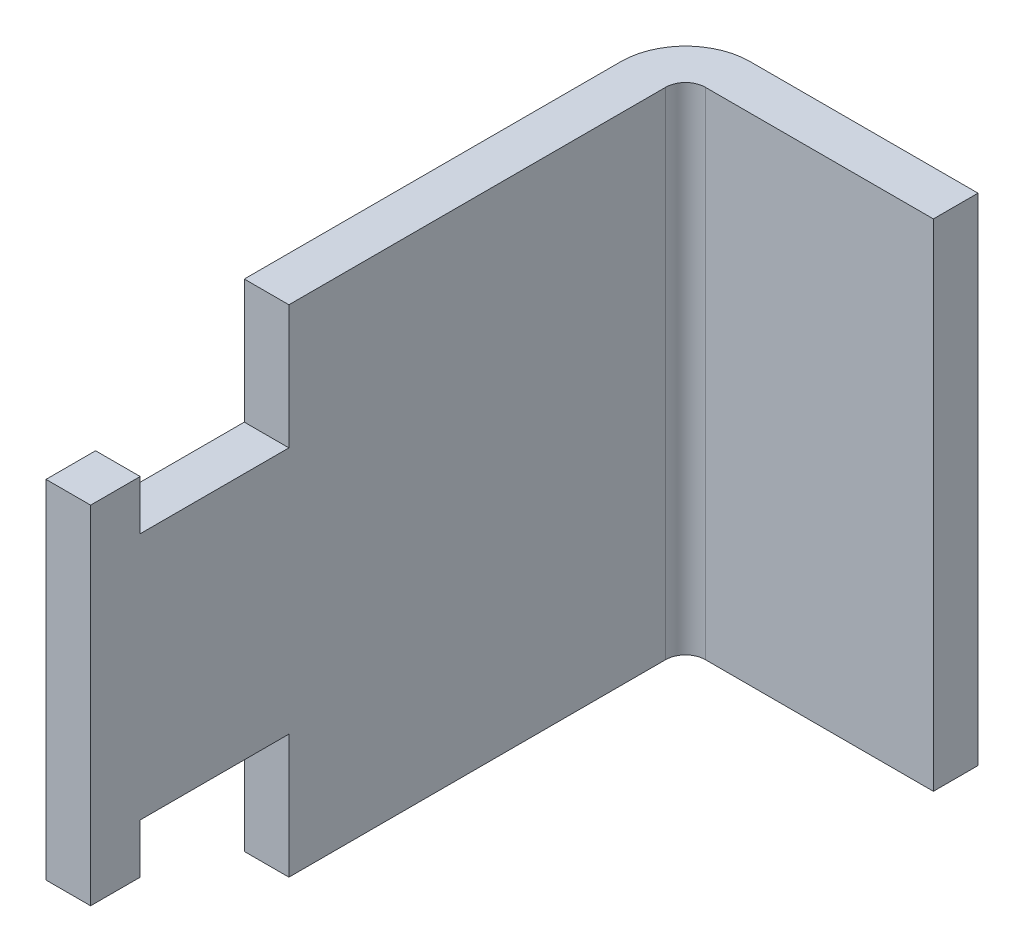
ISO-10303-21;
HEADER;
FILE_DESCRIPTION(('STEP AP214'),'2;1');
FILE_NAME('part.step','',(''),(''),'','','');
FILE_SCHEMA(('AUTOMOTIVE_DESIGN { 1 0 10303 214 1 1 1 1 }'));
ENDSEC;
DATA;
#1=APPLICATION_CONTEXT('core data for automotive mechanical design processes');
#2=APPLICATION_PROTOCOL_DEFINITION('international standard','automotive_design',2000,#1);
#3=PRODUCT_CONTEXT('',#1,'mechanical');
#4=PRODUCT('Part','Part','',(#3));
#5=PRODUCT_RELATED_PRODUCT_CATEGORY('part','',(#4));
#6=PRODUCT_DEFINITION_FORMATION('','',#4);
#7=PRODUCT_DEFINITION_CONTEXT('part definition',#1,'design');
#8=PRODUCT_DEFINITION('design','',#6,#7);
#9=PRODUCT_DEFINITION_SHAPE('','',#8);
#10=(LENGTH_UNIT() NAMED_UNIT(*) SI_UNIT(.MILLI.,.METRE.));
#11=(NAMED_UNIT(*) PLANE_ANGLE_UNIT() SI_UNIT($,.RADIAN.));
#12=(NAMED_UNIT(*) SI_UNIT($,.STERADIAN.) SOLID_ANGLE_UNIT());
#13=UNCERTAINTY_MEASURE_WITH_UNIT(LENGTH_MEASURE(1.E-05),#10,'distance_accuracy_value','');
#14=(GEOMETRIC_REPRESENTATION_CONTEXT(3) GLOBAL_UNCERTAINTY_ASSIGNED_CONTEXT((#13)) GLOBAL_UNIT_ASSIGNED_CONTEXT((#10,
#11,#12)) REPRESENTATION_CONTEXT('',''));
#15=CARTESIAN_POINT('',(0.,0.,0.));
#16=DIRECTION('',(0.,0.,1.));
#17=DIRECTION('',(1.,0.,0.));
#18=AXIS2_PLACEMENT_3D('',#15,#16,#17);
#19=CARTESIAN_POINT('',(2.95,-2.5,0.));
#20=DIRECTION('',(1.,0.,0.));
#21=DIRECTION('',(0.,1.,0.));
#22=AXIS2_PLACEMENT_3D('',#19,#20,#21);
#23=PLANE('',#22);
#24=DIRECTION('',(0.,0.,1.));
#25=VECTOR('',#24,1.);
#26=CARTESIAN_POINT('',(2.95,2.5,0.));
#27=LINE('',#26,#25);
#28=CARTESIAN_POINT('',(2.95,2.5,0.));
#29=VERTEX_POINT('',#28);
#30=CARTESIAN_POINT('',(2.95,2.5,0.45));
#31=VERTEX_POINT('',#30);
#32=EDGE_CURVE('E139',#29,#31,#27,.T.);
#33=ORIENTED_EDGE('',*,*,#32,.T.);
#34=DIRECTION('',(0.,1.,0.));
#35=VECTOR('',#34,1.);
#36=CARTESIAN_POINT('',(2.95,2.5,0.45));
#37=LINE('',#36,#35);
#38=CARTESIAN_POINT('',(2.95,-2.5,0.45));
#39=VERTEX_POINT('',#38);
#40=EDGE_CURVE('E280',#31,#39,#37,.F.);
#41=ORIENTED_EDGE('',*,*,#40,.T.);
#42=DIRECTION('',(0.,0.,1.));
#43=VECTOR('',#42,1.);
#44=CARTESIAN_POINT('',(2.95,-2.5,0.));
#45=LINE('',#44,#43);
#46=CARTESIAN_POINT('',(2.95,-2.5,0.));
#47=VERTEX_POINT('',#46);
#48=EDGE_CURVE('E325',#39,#47,#45,.F.);
#49=ORIENTED_EDGE('',*,*,#48,.T.);
#50=DIRECTION('',(0.,1.,0.));
#51=VECTOR('',#50,1.);
#52=CARTESIAN_POINT('',(2.95,-2.5,0.));
#53=LINE('',#52,#51);
#54=EDGE_CURVE('E277',#47,#29,#53,.T.);
#55=ORIENTED_EDGE('',*,*,#54,.T.);
#56=EDGE_LOOP('',(#33,#41,#49,#55));
#57=FACE_BOUND('',#56,.T.);
#58=ADVANCED_FACE('F17',(#57),#23,.T.);
#59=CARTESIAN_POINT('',(0.65,-2.5,0.65));
#60=DIRECTION('',(0.,-1.,0.));
#61=DIRECTION('',(1.,0.,0.));
#62=AXIS2_PLACEMENT_3D('',#59,#60,#61);
#63=CYLINDRICAL_SURFACE('',#62,0.65);
#64=CARTESIAN_POINT('',(0.65,2.5,0.65));
#65=DIRECTION('',(0.,-1.,0.));
#66=DIRECTION('',(1.,0.,0.));
#67=AXIS2_PLACEMENT_3D('',#64,#65,#66);
#68=CIRCLE('',#67,0.65);
#69=CARTESIAN_POINT('',(0.,2.5,0.65));
#70=VERTEX_POINT('',#69);
#71=CARTESIAN_POINT('',(0.65,2.5,0.));
#72=VERTEX_POINT('',#71);
#73=EDGE_CURVE('E138',#70,#72,#68,.T.);
#74=ORIENTED_EDGE('',*,*,#73,.T.);
#75=DIRECTION('',(0.,1.,0.));
#76=VECTOR('',#75,1.);
#77=CARTESIAN_POINT('',(0.65,-2.5,0.));
#78=LINE('',#77,#76);
#79=CARTESIAN_POINT('',(0.65,-2.5,0.));
#80=VERTEX_POINT('',#79);
#81=EDGE_CURVE('E136',#72,#80,#78,.F.);
#82=ORIENTED_EDGE('',*,*,#81,.T.);
#83=CARTESIAN_POINT('',(0.65,-2.5,0.65));
#84=DIRECTION('',(0.,-1.,0.));
#85=DIRECTION('',(1.,0.,0.));
#86=AXIS2_PLACEMENT_3D('',#83,#84,#85);
#87=CIRCLE('',#86,0.65);
#88=CARTESIAN_POINT('',(0.,-2.5,0.65));
#89=VERTEX_POINT('',#88);
#90=EDGE_CURVE('E20',#80,#89,#87,.F.);
#91=ORIENTED_EDGE('',*,*,#90,.T.);
#92=DIRECTION('',(0.,1.,0.));
#93=VECTOR('',#92,1.);
#94=CARTESIAN_POINT('',(0.,-2.5,0.65));
#95=LINE('',#94,#93);
#96=EDGE_CURVE('E133',#89,#70,#95,.T.);
#97=ORIENTED_EDGE('',*,*,#96,.T.);
#98=EDGE_LOOP('',(#74,#82,#91,#97));
#99=FACE_BOUND('',#98,.T.);
#100=ADVANCED_FACE('F132',(#99),#63,.T.);
#101=CARTESIAN_POINT('',(2.95,2.5,0.45));
#102=DIRECTION('',(0.,0.,-1.));
#103=DIRECTION('',(-1.,0.,0.));
#104=AXIS2_PLACEMENT_3D('',#101,#102,#103);
#105=PLANE('',#104);
#106=DIRECTION('',(0.,1.,0.));
#107=VECTOR('',#106,1.);
#108=CARTESIAN_POINT('',(0.65,-2.5,0.45));
#109=LINE('',#108,#107);
#110=CARTESIAN_POINT('',(0.65,2.5,0.45));
#111=VERTEX_POINT('',#110);
#112=CARTESIAN_POINT('',(0.65,-2.5,0.45));
#113=VERTEX_POINT('',#112);
#114=EDGE_CURVE('E287',#111,#113,#109,.F.);
#115=ORIENTED_EDGE('',*,*,#114,.T.);
#116=DIRECTION('',(1.,0.,0.));
#117=VECTOR('',#116,1.);
#118=CARTESIAN_POINT('',(2.95,-2.5,0.45));
#119=LINE('',#118,#117);
#120=EDGE_CURVE('E158',#113,#39,#119,.T.);
#121=ORIENTED_EDGE('',*,*,#120,.T.);
#122=ORIENTED_EDGE('',*,*,#40,.F.);
#123=DIRECTION('',(1.,0.,0.));
#124=VECTOR('',#123,1.);
#125=CARTESIAN_POINT('',(2.95,2.5,0.45));
#126=LINE('',#125,#124);
#127=EDGE_CURVE('E198',#31,#111,#126,.F.);
#128=ORIENTED_EDGE('',*,*,#127,.T.);
#129=EDGE_LOOP('',(#115,#121,#122,#128));
#130=FACE_BOUND('',#129,.T.);
#131=ADVANCED_FACE('F346',(#130),#105,.F.);
#132=CARTESIAN_POINT('',(2.95,-2.5,0.));
#133=DIRECTION('',(0.,0.,1.));
#134=DIRECTION('',(1.,0.,0.));
#135=AXIS2_PLACEMENT_3D('',#132,#133,#134);
#136=PLANE('',#135);
#137=ORIENTED_EDGE('',*,*,#81,.F.);
#138=DIRECTION('',(1.,0.,0.));
#139=VECTOR('',#138,1.);
#140=CARTESIAN_POINT('',(2.95,2.5,0.));
#141=LINE('',#140,#139);
#142=EDGE_CURVE('E200',#72,#29,#141,.T.);
#143=ORIENTED_EDGE('',*,*,#142,.T.);
#144=ORIENTED_EDGE('',*,*,#54,.F.);
#145=DIRECTION('',(1.,0.,0.));
#146=VECTOR('',#145,1.);
#147=CARTESIAN_POINT('',(2.95,-2.5,0.));
#148=LINE('',#147,#146);
#149=EDGE_CURVE('E154',#47,#80,#148,.F.);
#150=ORIENTED_EDGE('',*,*,#149,.T.);
#151=EDGE_LOOP('',(#137,#143,#144,#150));
#152=FACE_BOUND('',#151,.T.);
#153=ADVANCED_FACE('F338',(#152),#136,.F.);
#154=CARTESIAN_POINT('',(0.,-2.5,0.));
#155=DIRECTION('',(1.,0.,0.));
#156=DIRECTION('',(0.,1.,0.));
#157=AXIS2_PLACEMENT_3D('',#154,#155,#156);
#158=PLANE('',#157);
#159=DIRECTION('',(0.,1.,0.));
#160=VECTOR('',#159,1.);
#161=CARTESIAN_POINT('',(0.,-2.5,6.45));
#162=LINE('',#161,#160);
#163=CARTESIAN_POINT('',(0.,1.75,6.45));
#164=VERTEX_POINT('',#163);
#165=CARTESIAN_POINT('',(0.,-1.75,6.45));
#166=VERTEX_POINT('',#165);
#167=EDGE_CURVE('E266',#164,#166,#162,.F.);
#168=ORIENTED_EDGE('',*,*,#167,.F.);
#169=DIRECTION('',(0.,0.,-1.));
#170=VECTOR('',#169,1.);
#171=CARTESIAN_POINT('',(0.,1.75,6.45));
#172=LINE('',#171,#170);
#173=CARTESIAN_POINT('',(0.,1.75,5.95));
#174=VERTEX_POINT('',#173);
#175=EDGE_CURVE('E252',#164,#174,#172,.T.);
#176=ORIENTED_EDGE('',*,*,#175,.T.);
#177=DIRECTION('',(0.,1.,0.));
#178=VECTOR('',#177,1.);
#179=CARTESIAN_POINT('',(0.,1.75,5.95));
#180=LINE('',#179,#178);
#181=CARTESIAN_POINT('',(0.,1.25,5.95));
#182=VERTEX_POINT('',#181);
#183=EDGE_CURVE('E241',#174,#182,#180,.F.);
#184=ORIENTED_EDGE('',*,*,#183,.T.);
#185=DIRECTION('',(0.,0.,-1.));
#186=VECTOR('',#185,1.);
#187=CARTESIAN_POINT('',(0.,1.25,5.95));
#188=LINE('',#187,#186);
#189=CARTESIAN_POINT('',(0.,1.25,4.45));
#190=VERTEX_POINT('',#189);
#191=EDGE_CURVE('E230',#182,#190,#188,.T.);
#192=ORIENTED_EDGE('',*,*,#191,.T.);
#193=DIRECTION('',(0.,1.,0.));
#194=VECTOR('',#193,1.);
#195=CARTESIAN_POINT('',(0.,1.25,4.45));
#196=LINE('',#195,#194);
#197=CARTESIAN_POINT('',(0.,2.5,4.45));
#198=VERTEX_POINT('',#197);
#199=EDGE_CURVE('E219',#190,#198,#196,.T.);
#200=ORIENTED_EDGE('',*,*,#199,.T.);
#201=DIRECTION('',(0.,0.,-1.));
#202=VECTOR('',#201,1.);
#203=CARTESIAN_POINT('',(0.,2.5,0.));
#204=LINE('',#203,#202);
#205=EDGE_CURVE('E147',#198,#70,#204,.T.);
#206=ORIENTED_EDGE('',*,*,#205,.T.);
#207=ORIENTED_EDGE('',*,*,#96,.F.);
#208=DIRECTION('',(0.,0.,1.));
#209=VECTOR('',#208,1.);
#210=CARTESIAN_POINT('',(0.,-2.5,0.45));
#211=LINE('',#210,#209);
#212=CARTESIAN_POINT('',(0.,-2.5,4.45));
#213=VERTEX_POINT('',#212);
#214=EDGE_CURVE('E144',#89,#213,#211,.T.);
#215=ORIENTED_EDGE('',*,*,#214,.T.);
#216=DIRECTION('',(0.,1.,0.));
#217=VECTOR('',#216,1.);
#218=CARTESIAN_POINT('',(0.,-2.5,4.45));
#219=LINE('',#218,#217);
#220=CARTESIAN_POINT('',(0.,-1.25,4.45));
#221=VERTEX_POINT('',#220);
#222=EDGE_CURVE('E149',#221,#213,#219,.F.);
#223=ORIENTED_EDGE('',*,*,#222,.F.);
#224=DIRECTION('',(0.,0.,1.));
#225=VECTOR('',#224,1.);
#226=CARTESIAN_POINT('',(0.,-1.25,0.));
#227=LINE('',#226,#225);
#228=CARTESIAN_POINT('',(0.,-1.25,5.95));
#229=VERTEX_POINT('',#228);
#230=EDGE_CURVE('E272',#229,#221,#227,.F.);
#231=ORIENTED_EDGE('',*,*,#230,.F.);
#232=DIRECTION('',(0.,1.,0.));
#233=VECTOR('',#232,1.);
#234=CARTESIAN_POINT('',(0.,-2.5,5.95));
#235=LINE('',#234,#233);
#236=CARTESIAN_POINT('',(0.,-1.75,5.95));
#237=VERTEX_POINT('',#236);
#238=EDGE_CURVE('E276',#237,#229,#235,.T.);
#239=ORIENTED_EDGE('',*,*,#238,.F.);
#240=DIRECTION('',(0.,0.,1.));
#241=VECTOR('',#240,1.);
#242=CARTESIAN_POINT('',(0.,-1.75,0.));
#243=LINE('',#242,#241);
#244=EDGE_CURVE('E148',#166,#237,#243,.F.);
#245=ORIENTED_EDGE('',*,*,#244,.F.);
#246=EDGE_LOOP('',(#168,#176,#184,#192,#200,#206,#207,#215,#223,#231,#239,#245));
#247=FACE_BOUND('',#246,.T.);
#248=ADVANCED_FACE('F143',(#247),#158,.F.);
#249=CARTESIAN_POINT('',(0.,-2.5,6.45));
#250=DIRECTION('',(0.,0.,1.));
#251=DIRECTION('',(1.,0.,0.));
#252=AXIS2_PLACEMENT_3D('',#249,#250,#251);
#253=PLANE('',#252);
#254=DIRECTION('',(0.,1.,0.));
#255=VECTOR('',#254,1.);
#256=CARTESIAN_POINT('',(0.45,-2.5,6.45));
#257=LINE('',#256,#255);
#258=CARTESIAN_POINT('',(0.45,-1.75,6.45));
#259=VERTEX_POINT('',#258);
#260=CARTESIAN_POINT('',(0.45,1.75,6.45));
#261=VERTEX_POINT('',#260);
#262=EDGE_CURVE('E246',#259,#261,#257,.T.);
#263=ORIENTED_EDGE('',*,*,#262,.T.);
#264=DIRECTION('',(1.,0.,0.));
#265=VECTOR('',#264,1.);
#266=CARTESIAN_POINT('',(-8.227845354695,1.75,6.45));
#267=LINE('',#266,#265);
#268=EDGE_CURVE('E249',#261,#164,#267,.F.);
#269=ORIENTED_EDGE('',*,*,#268,.T.);
#270=ORIENTED_EDGE('',*,*,#167,.T.);
#271=DIRECTION('',(1.,0.,0.));
#272=VECTOR('',#271,1.);
#273=CARTESIAN_POINT('',(-8.227845354695,-1.75,6.45));
#274=LINE('',#273,#272);
#275=EDGE_CURVE('E257',#259,#166,#274,.F.);
#276=ORIENTED_EDGE('',*,*,#275,.F.);
#277=EDGE_LOOP('',(#263,#269,#270,#276));
#278=FACE_BOUND('',#277,.T.);
#279=ADVANCED_FACE('F370',(#278),#253,.T.);
#280=CARTESIAN_POINT('',(-8.227845354695,1.75,6.45));
#281=DIRECTION('',(0.,-1.,0.));
#282=DIRECTION('',(0.,0.,-1.));
#283=AXIS2_PLACEMENT_3D('',#280,#281,#282);
#284=PLANE('',#283);
#285=DIRECTION('',(0.,0.,1.));
#286=VECTOR('',#285,1.);
#287=CARTESIAN_POINT('',(0.45,1.75,6.45));
#288=LINE('',#287,#286);
#289=CARTESIAN_POINT('',(0.45,1.75,5.95));
#290=VERTEX_POINT('',#289);
#291=EDGE_CURVE('E235',#261,#290,#288,.F.);
#292=ORIENTED_EDGE('',*,*,#291,.T.);
#293=DIRECTION('',(1.,0.,0.));
#294=VECTOR('',#293,1.);
#295=CARTESIAN_POINT('',(-8.227845354695,1.75,5.95));
#296=LINE('',#295,#294);
#297=EDGE_CURVE('E238',#290,#174,#296,.F.);
#298=ORIENTED_EDGE('',*,*,#297,.T.);
#299=ORIENTED_EDGE('',*,*,#175,.F.);
#300=ORIENTED_EDGE('',*,*,#268,.F.);
#301=EDGE_LOOP('',(#292,#298,#299,#300));
#302=FACE_BOUND('',#301,.T.);
#303=ADVANCED_FACE('F367',(#302),#284,.F.);
#304=CARTESIAN_POINT('',(-8.227845354695,1.75,5.95));
#305=DIRECTION('',(0.,0.,1.));
#306=DIRECTION('',(1.,0.,0.));
#307=AXIS2_PLACEMENT_3D('',#304,#305,#306);
#308=PLANE('',#307);
#309=DIRECTION('',(0.,1.,0.));
#310=VECTOR('',#309,1.);
#311=CARTESIAN_POINT('',(0.45,-2.5,5.95));
#312=LINE('',#311,#310);
#313=CARTESIAN_POINT('',(0.45,1.25,5.95));
#314=VERTEX_POINT('',#313);
#315=EDGE_CURVE('E224',#290,#314,#312,.F.);
#316=ORIENTED_EDGE('',*,*,#315,.T.);
#317=DIRECTION('',(1.,0.,0.));
#318=VECTOR('',#317,1.);
#319=CARTESIAN_POINT('',(-8.227845354695,1.25,5.95));
#320=LINE('',#319,#318);
#321=EDGE_CURVE('E227',#314,#182,#320,.F.);
#322=ORIENTED_EDGE('',*,*,#321,.T.);
#323=ORIENTED_EDGE('',*,*,#183,.F.);
#324=ORIENTED_EDGE('',*,*,#297,.F.);
#325=EDGE_LOOP('',(#316,#322,#323,#324));
#326=FACE_BOUND('',#325,.T.);
#327=ADVANCED_FACE('F365',(#326),#308,.F.);
#328=CARTESIAN_POINT('',(-8.227845354695,1.25,5.95));
#329=DIRECTION('',(0.,-1.,0.));
#330=DIRECTION('',(0.,0.,-1.));
#331=AXIS2_PLACEMENT_3D('',#328,#329,#330);
#332=PLANE('',#331);
#333=DIRECTION('',(0.,0.,1.));
#334=VECTOR('',#333,1.);
#335=CARTESIAN_POINT('',(0.45,1.25,6.45));
#336=LINE('',#335,#334);
#337=CARTESIAN_POINT('',(0.45,1.25,4.45));
#338=VERTEX_POINT('',#337);
#339=EDGE_CURVE('E214',#314,#338,#336,.F.);
#340=ORIENTED_EDGE('',*,*,#339,.T.);
#341=DIRECTION('',(-1.,0.,0.));
#342=VECTOR('',#341,1.);
#343=CARTESIAN_POINT('',(-8.227845354695,1.25,4.45));
#344=LINE('',#343,#342);
#345=EDGE_CURVE('E205',#338,#190,#344,.T.);
#346=ORIENTED_EDGE('',*,*,#345,.T.);
#347=ORIENTED_EDGE('',*,*,#191,.F.);
#348=ORIENTED_EDGE('',*,*,#321,.F.);
#349=EDGE_LOOP('',(#340,#346,#347,#348));
#350=FACE_BOUND('',#349,.T.);
#351=ADVANCED_FACE('F361',(#350),#332,.F.);
#352=CARTESIAN_POINT('',(-8.227845354695,1.25,4.45));
#353=DIRECTION('',(0.,0.,-1.));
#354=DIRECTION('',(-1.,0.,0.));
#355=AXIS2_PLACEMENT_3D('',#352,#353,#354);
#356=PLANE('',#355);
#357=DIRECTION('',(0.,1.,0.));
#358=VECTOR('',#357,1.);
#359=CARTESIAN_POINT('',(0.45,-2.5,4.45));
#360=LINE('',#359,#358);
#361=CARTESIAN_POINT('',(0.45,2.5,4.45));
#362=VERTEX_POINT('',#361);
#363=EDGE_CURVE('E190',#338,#362,#360,.T.);
#364=ORIENTED_EDGE('',*,*,#363,.T.);
#365=DIRECTION('',(1.,0.,0.));
#366=VECTOR('',#365,1.);
#367=CARTESIAN_POINT('',(2.95,2.5,4.45));
#368=LINE('',#367,#366);
#369=EDGE_CURVE('E195',#362,#198,#368,.F.);
#370=ORIENTED_EDGE('',*,*,#369,.T.);
#371=ORIENTED_EDGE('',*,*,#199,.F.);
#372=ORIENTED_EDGE('',*,*,#345,.F.);
#373=EDGE_LOOP('',(#364,#370,#371,#372));
#374=FACE_BOUND('',#373,.T.);
#375=ADVANCED_FACE('F359',(#374),#356,.F.);
#376=CARTESIAN_POINT('',(2.95,2.5,0.));
#377=DIRECTION('',(0.,-1.,0.));
#378=DIRECTION('',(0.,0.,-1.));
#379=AXIS2_PLACEMENT_3D('',#376,#377,#378);
#380=PLANE('',#379);
#381=ORIENTED_EDGE('',*,*,#369,.F.);
#382=DIRECTION('',(0.,0.,1.));
#383=VECTOR('',#382,1.);
#384=CARTESIAN_POINT('',(0.45,2.5,6.45));
#385=LINE('',#384,#383);
#386=CARTESIAN_POINT('',(0.45,2.5,0.65));
#387=VERTEX_POINT('',#386);
#388=EDGE_CURVE('E177',#362,#387,#385,.F.);
#389=ORIENTED_EDGE('',*,*,#388,.T.);
#390=CARTESIAN_POINT('',(0.65,2.5,0.65));
#391=DIRECTION('',(0.,1.,0.));
#392=DIRECTION('',(0.,0.,1.));
#393=AXIS2_PLACEMENT_3D('',#390,#391,#392);
#394=CIRCLE('',#393,0.2);
#395=EDGE_CURVE('E194',#387,#111,#394,.F.);
#396=ORIENTED_EDGE('',*,*,#395,.T.);
#397=ORIENTED_EDGE('',*,*,#127,.F.);
#398=ORIENTED_EDGE('',*,*,#32,.F.);
#399=ORIENTED_EDGE('',*,*,#142,.F.);
#400=ORIENTED_EDGE('',*,*,#73,.F.);
#401=ORIENTED_EDGE('',*,*,#205,.F.);
#402=EDGE_LOOP('',(#381,#389,#396,#397,#398,#399,#400,#401));
#403=FACE_BOUND('',#402,.T.);
#404=ADVANCED_FACE('F340',(#403),#380,.F.);
#405=CARTESIAN_POINT('',(0.65,-2.5,0.65));
#406=DIRECTION('',(0.,1.,0.));
#407=DIRECTION('',(0.,0.,1.));
#408=AXIS2_PLACEMENT_3D('',#405,#406,#407);
#409=CYLINDRICAL_SURFACE('',#408,0.2);
#410=ORIENTED_EDGE('',*,*,#114,.F.);
#411=ORIENTED_EDGE('',*,*,#395,.F.);
#412=DIRECTION('',(0.,1.,0.));
#413=VECTOR('',#412,1.);
#414=CARTESIAN_POINT('',(0.45,-2.5,0.65));
#415=LINE('',#414,#413);
#416=CARTESIAN_POINT('',(0.45,-2.5,0.65));
#417=VERTEX_POINT('',#416);
#418=EDGE_CURVE('E173',#387,#417,#415,.F.);
#419=ORIENTED_EDGE('',*,*,#418,.T.);
#420=CARTESIAN_POINT('',(0.65,-2.5,0.65));
#421=DIRECTION('',(0.,1.,0.));
#422=DIRECTION('',(0.,0.,1.));
#423=AXIS2_PLACEMENT_3D('',#420,#421,#422);
#424=CIRCLE('',#423,0.2);
#425=EDGE_CURVE('E170',#417,#113,#424,.F.);
#426=ORIENTED_EDGE('',*,*,#425,.T.);
#427=EDGE_LOOP('',(#410,#411,#419,#426));
#428=FACE_BOUND('',#427,.T.);
#429=ADVANCED_FACE('F349',(#428),#409,.F.);
#430=CARTESIAN_POINT('',(2.95,-2.5,0.45));
#431=DIRECTION('',(0.,1.,0.));
#432=DIRECTION('',(0.,0.,1.));
#433=AXIS2_PLACEMENT_3D('',#430,#431,#432);
#434=PLANE('',#433);
#435=ORIENTED_EDGE('',*,*,#214,.F.);
#436=ORIENTED_EDGE('',*,*,#90,.F.);
#437=ORIENTED_EDGE('',*,*,#149,.F.);
#438=ORIENTED_EDGE('',*,*,#48,.F.);
#439=ORIENTED_EDGE('',*,*,#120,.F.);
#440=ORIENTED_EDGE('',*,*,#425,.F.);
#441=DIRECTION('',(0.,0.,1.));
#442=VECTOR('',#441,1.);
#443=CARTESIAN_POINT('',(0.45,-2.5,6.45));
#444=LINE('',#443,#442);
#445=CARTESIAN_POINT('',(0.45,-2.5,4.45));
#446=VERTEX_POINT('',#445);
#447=EDGE_CURVE('E176',#417,#446,#444,.T.);
#448=ORIENTED_EDGE('',*,*,#447,.T.);
#449=DIRECTION('',(1.,0.,0.));
#450=VECTOR('',#449,1.);
#451=CARTESIAN_POINT('',(-8.227845354695,-2.5,4.45));
#452=LINE('',#451,#450);
#453=EDGE_CURVE('E153',#213,#446,#452,.T.);
#454=ORIENTED_EDGE('',*,*,#453,.F.);
#455=EDGE_LOOP('',(#435,#436,#437,#438,#439,#440,#448,#454));
#456=FACE_BOUND('',#455,.T.);
#457=ADVANCED_FACE('F151',(#456),#434,.F.);
#458=CARTESIAN_POINT('',(-8.227845354695,-1.25,4.45));
#459=DIRECTION('',(0.,0.,1.));
#460=DIRECTION('',(1.,0.,0.));
#461=AXIS2_PLACEMENT_3D('',#458,#459,#460);
#462=PLANE('',#461);
#463=DIRECTION('',(0.,1.,0.));
#464=VECTOR('',#463,1.);
#465=CARTESIAN_POINT('',(0.45,-2.5,4.45));
#466=LINE('',#465,#464);
#467=CARTESIAN_POINT('',(0.450000000000001,-1.25,4.45));
#468=VERTEX_POINT('',#467);
#469=EDGE_CURVE('E179',#446,#468,#466,.T.);
#470=ORIENTED_EDGE('',*,*,#469,.T.);
#471=DIRECTION('',(1.,0.,0.));
#472=VECTOR('',#471,1.);
#473=CARTESIAN_POINT('',(-8.227845354695,-1.25,4.45));
#474=LINE('',#473,#472);
#475=EDGE_CURVE('E156',#221,#468,#474,.T.);
#476=ORIENTED_EDGE('',*,*,#475,.F.);
#477=ORIENTED_EDGE('',*,*,#222,.T.);
#478=ORIENTED_EDGE('',*,*,#453,.T.);
#479=EDGE_LOOP('',(#470,#476,#477,#478));
#480=FACE_BOUND('',#479,.T.);
#481=ADVANCED_FACE('F383',(#480),#462,.T.);
#482=CARTESIAN_POINT('',(-8.227845354695,-1.25,5.95));
#483=DIRECTION('',(0.,-1.,0.));
#484=DIRECTION('',(0.,0.,-1.));
#485=AXIS2_PLACEMENT_3D('',#482,#483,#484);
#486=PLANE('',#485);
#487=DIRECTION('',(0.,0.,1.));
#488=VECTOR('',#487,1.);
#489=CARTESIAN_POINT('',(0.45,-1.25,6.45));
#490=LINE('',#489,#488);
#491=CARTESIAN_POINT('',(0.450000000000001,-1.25,5.95));
#492=VERTEX_POINT('',#491);
#493=EDGE_CURVE('E162',#468,#492,#490,.T.);
#494=ORIENTED_EDGE('',*,*,#493,.T.);
#495=DIRECTION('',(-1.,0.,0.));
#496=VECTOR('',#495,1.);
#497=CARTESIAN_POINT('',(-8.227845354695,-1.25,5.95));
#498=LINE('',#497,#496);
#499=EDGE_CURVE('E308',#229,#492,#498,.F.);
#500=ORIENTED_EDGE('',*,*,#499,.F.);
#501=ORIENTED_EDGE('',*,*,#230,.T.);
#502=ORIENTED_EDGE('',*,*,#475,.T.);
#503=EDGE_LOOP('',(#494,#500,#501,#502));
#504=FACE_BOUND('',#503,.T.);
#505=ADVANCED_FACE('F379',(#504),#486,.T.);
#506=CARTESIAN_POINT('',(-8.227845354695,-1.75,5.95));
#507=DIRECTION('',(0.,0.,-1.));
#508=DIRECTION('',(-1.,0.,0.));
#509=AXIS2_PLACEMENT_3D('',#506,#507,#508);
#510=PLANE('',#509);
#511=DIRECTION('',(0.,1.,0.));
#512=VECTOR('',#511,1.);
#513=CARTESIAN_POINT('',(0.45,-2.5,5.95));
#514=LINE('',#513,#512);
#515=CARTESIAN_POINT('',(0.450000000000001,-1.75,5.95));
#516=VERTEX_POINT('',#515);
#517=EDGE_CURVE('E26',#492,#516,#514,.F.);
#518=ORIENTED_EDGE('',*,*,#517,.T.);
#519=DIRECTION('',(1.,0.,0.));
#520=VECTOR('',#519,1.);
#521=CARTESIAN_POINT('',(-8.227845354695,-1.75,5.95));
#522=LINE('',#521,#520);
#523=EDGE_CURVE('E34',#237,#516,#522,.T.);
#524=ORIENTED_EDGE('',*,*,#523,.F.);
#525=ORIENTED_EDGE('',*,*,#238,.T.);
#526=ORIENTED_EDGE('',*,*,#499,.T.);
#527=EDGE_LOOP('',(#518,#524,#525,#526));
#528=FACE_BOUND('',#527,.T.);
#529=ADVANCED_FACE('F376',(#528),#510,.T.);
#530=CARTESIAN_POINT('',(-8.227845354695,-1.75,6.45));
#531=DIRECTION('',(0.,-1.,0.));
#532=DIRECTION('',(0.,0.,-1.));
#533=AXIS2_PLACEMENT_3D('',#530,#531,#532);
#534=PLANE('',#533);
#535=DIRECTION('',(0.,0.,1.));
#536=VECTOR('',#535,1.);
#537=CARTESIAN_POINT('',(0.45,-1.75,6.45));
#538=LINE('',#537,#536);
#539=EDGE_CURVE('E11',#516,#259,#538,.T.);
#540=ORIENTED_EDGE('',*,*,#539,.T.);
#541=ORIENTED_EDGE('',*,*,#275,.T.);
#542=ORIENTED_EDGE('',*,*,#244,.T.);
#543=ORIENTED_EDGE('',*,*,#523,.T.);
#544=EDGE_LOOP('',(#540,#541,#542,#543));
#545=FACE_BOUND('',#544,.T.);
#546=ADVANCED_FACE('F371',(#545),#534,.T.);
#547=CARTESIAN_POINT('',(0.45,-2.5,6.45));
#548=DIRECTION('',(-1.,0.,0.));
#549=DIRECTION('',(0.,0.,1.));
#550=AXIS2_PLACEMENT_3D('',#547,#548,#549);
#551=PLANE('',#550);
#552=ORIENTED_EDGE('',*,*,#517,.F.);
#553=ORIENTED_EDGE('',*,*,#493,.F.);
#554=ORIENTED_EDGE('',*,*,#469,.F.);
#555=ORIENTED_EDGE('',*,*,#447,.F.);
#556=ORIENTED_EDGE('',*,*,#418,.F.);
#557=ORIENTED_EDGE('',*,*,#388,.F.);
#558=ORIENTED_EDGE('',*,*,#363,.F.);
#559=ORIENTED_EDGE('',*,*,#339,.F.);
#560=ORIENTED_EDGE('',*,*,#315,.F.);
#561=ORIENTED_EDGE('',*,*,#291,.F.);
#562=ORIENTED_EDGE('',*,*,#262,.F.);
#563=ORIENTED_EDGE('',*,*,#539,.F.);
#564=EDGE_LOOP('',(#552,#553,#554,#555,#556,#557,#558,#559,#560,#561,#562,#563));
#565=FACE_BOUND('',#564,.T.);
#566=ADVANCED_FACE('F355',(#565),#551,.F.);
#567=CLOSED_SHELL('',(#58,#100,#131,#153,#248,#279,#303,#327,#351,#375,#404,#429,#457,#481,#505,
#529,#546,#566));
#568=MANIFOLD_SOLID_BREP('B1',#567);
#569=ADVANCED_BREP_SHAPE_REPRESENTATION('',(#18,#568),#14);
#570=SHAPE_DEFINITION_REPRESENTATION(#9,#569);
ENDSEC;
END-ISO-10303-21;
